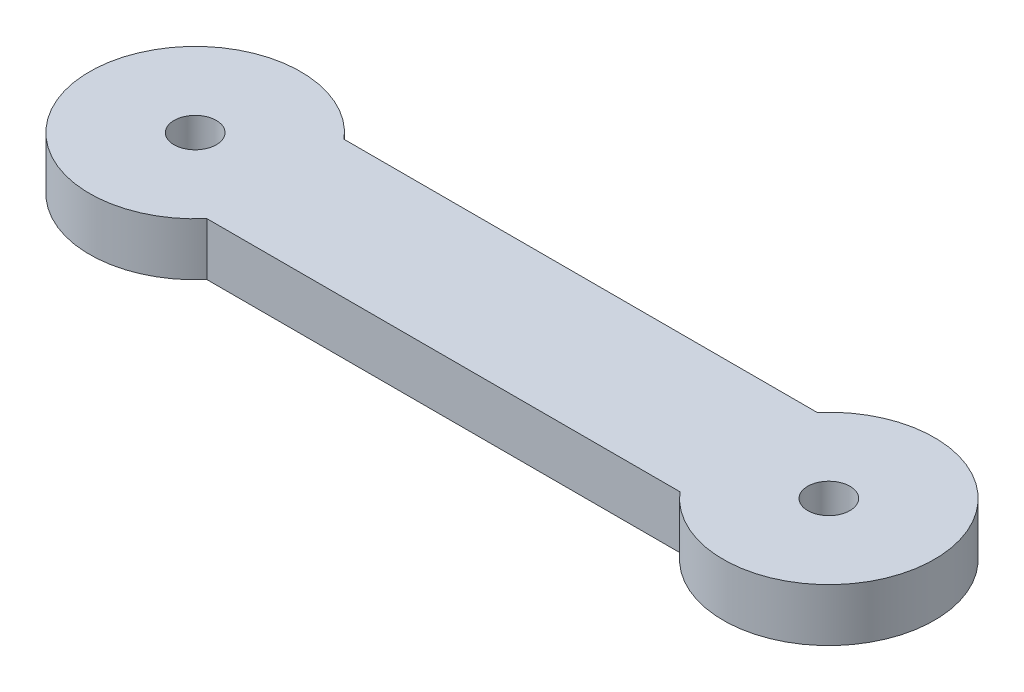
ISO-10303-21;
HEADER;
FILE_DESCRIPTION(('STEP AP214'),'2;1');
FILE_NAME('part.step','',(''),(''),'','','');
FILE_SCHEMA(('AUTOMOTIVE_DESIGN { 1 0 10303 214 1 1 1 1 }'));
ENDSEC;
DATA;
#1=APPLICATION_CONTEXT('core data for automotive mechanical design processes');
#2=APPLICATION_PROTOCOL_DEFINITION('international standard','automotive_design',2000,#1);
#3=PRODUCT_CONTEXT('',#1,'mechanical');
#4=PRODUCT('Part','Part','',(#3));
#5=PRODUCT_RELATED_PRODUCT_CATEGORY('part','',(#4));
#6=PRODUCT_DEFINITION_FORMATION('','',#4);
#7=PRODUCT_DEFINITION_CONTEXT('part definition',#1,'design');
#8=PRODUCT_DEFINITION('design','',#6,#7);
#9=PRODUCT_DEFINITION_SHAPE('','',#8);
#10=(LENGTH_UNIT() NAMED_UNIT(*) SI_UNIT(.MILLI.,.METRE.));
#11=(NAMED_UNIT(*) PLANE_ANGLE_UNIT() SI_UNIT($,.RADIAN.));
#12=(NAMED_UNIT(*) SI_UNIT($,.STERADIAN.) SOLID_ANGLE_UNIT());
#13=UNCERTAINTY_MEASURE_WITH_UNIT(LENGTH_MEASURE(1.E-05),#10,'distance_accuracy_value','');
#14=(GEOMETRIC_REPRESENTATION_CONTEXT(3) GLOBAL_UNCERTAINTY_ASSIGNED_CONTEXT((#13)) GLOBAL_UNIT_ASSIGNED_CONTEXT((#10,
#11,#12)) REPRESENTATION_CONTEXT('',''));
#15=CARTESIAN_POINT('',(0.,0.,0.));
#16=DIRECTION('',(0.,0.,1.));
#17=DIRECTION('',(1.,0.,0.));
#18=AXIS2_PLACEMENT_3D('',#15,#16,#17);
#19=CARTESIAN_POINT('',(30.,5.,0.));
#20=DIRECTION('',(0.,-1.,0.));
#21=DIRECTION('',(0.,0.,-1.));
#22=AXIS2_PLACEMENT_3D('',#19,#20,#21);
#23=CYLINDRICAL_SURFACE('',#22,10.);
#24=CARTESIAN_POINT('',(30.,0.,0.));
#25=DIRECTION('',(0.,1.,0.));
#26=DIRECTION('',(0.,0.,1.));
#27=AXIS2_PLACEMENT_3D('',#24,#25,#26);
#28=CIRCLE('',#27,10.);
#29=CARTESIAN_POINT('',(22.4006579232147,0.,6.5));
#30=VERTEX_POINT('',#29);
#31=CARTESIAN_POINT('',(22.4006579232147,0.,-6.5));
#32=VERTEX_POINT('',#31);
#33=EDGE_CURVE('E92',#30,#32,#28,.T.);
#34=ORIENTED_EDGE('',*,*,#33,.T.);
#35=DIRECTION('',(0.,-1.,0.));
#36=VECTOR('',#35,1.);
#37=CARTESIAN_POINT('',(22.4006579232147,5.,-6.5));
#38=LINE('',#37,#36);
#39=CARTESIAN_POINT('',(22.4006579232147,5.,-6.5));
#40=VERTEX_POINT('',#39);
#41=EDGE_CURVE('E11',#40,#32,#38,.T.);
#42=ORIENTED_EDGE('',*,*,#41,.F.);
#43=CARTESIAN_POINT('',(30.,5.,0.));
#44=DIRECTION('',(0.,1.,0.));
#45=DIRECTION('',(0.,0.,1.));
#46=AXIS2_PLACEMENT_3D('',#43,#44,#45);
#47=CIRCLE('',#46,10.);
#48=CARTESIAN_POINT('',(22.4006579232147,5.,6.5));
#49=VERTEX_POINT('',#48);
#50=EDGE_CURVE('E118',#49,#40,#47,.T.);
#51=ORIENTED_EDGE('',*,*,#50,.F.);
#52=DIRECTION('',(0.,-1.,0.));
#53=VECTOR('',#52,1.);
#54=CARTESIAN_POINT('',(22.4006579232147,5.,6.5));
#55=LINE('',#54,#53);
#56=EDGE_CURVE('E50',#49,#30,#55,.T.);
#57=ORIENTED_EDGE('',*,*,#56,.T.);
#58=EDGE_LOOP('',(#34,#42,#51,#57));
#59=FACE_BOUND('',#58,.T.);
#60=ADVANCED_FACE('F41',(#59),#23,.T.);
#61=CARTESIAN_POINT('',(0.,5.,-6.5));
#62=DIRECTION('',(0.,0.,-1.));
#63=DIRECTION('',(-1.,0.,0.));
#64=AXIS2_PLACEMENT_3D('',#61,#62,#63);
#65=PLANE('',#64);
#66=DIRECTION('',(1.,0.,0.));
#67=VECTOR('',#66,1.);
#68=CARTESIAN_POINT('',(0.,0.,-6.5));
#69=LINE('',#68,#67);
#70=CARTESIAN_POINT('',(-22.4006579232147,0.,-6.5));
#71=VERTEX_POINT('',#70);
#72=EDGE_CURVE('E82',#71,#32,#69,.T.);
#73=ORIENTED_EDGE('',*,*,#72,.F.);
#74=DIRECTION('',(0.,-1.,0.));
#75=VECTOR('',#74,1.);
#76=CARTESIAN_POINT('',(-22.4006579232147,5.,-6.5));
#77=LINE('',#76,#75);
#78=CARTESIAN_POINT('',(-22.4006579232147,5.,-6.5));
#79=VERTEX_POINT('',#78);
#80=EDGE_CURVE('E85',#79,#71,#77,.T.);
#81=ORIENTED_EDGE('',*,*,#80,.F.);
#82=DIRECTION('',(1.,0.,0.));
#83=VECTOR('',#82,1.);
#84=CARTESIAN_POINT('',(0.,5.,-6.5));
#85=LINE('',#84,#83);
#86=EDGE_CURVE('E74',#79,#40,#85,.T.);
#87=ORIENTED_EDGE('',*,*,#86,.T.);
#88=ORIENTED_EDGE('',*,*,#41,.T.);
#89=EDGE_LOOP('',(#73,#81,#87,#88));
#90=FACE_BOUND('',#89,.T.);
#91=ADVANCED_FACE('F84',(#90),#65,.T.);
#92=CARTESIAN_POINT('',(0.,5.,6.5));
#93=DIRECTION('',(0.,0.,1.));
#94=DIRECTION('',(1.,0.,0.));
#95=AXIS2_PLACEMENT_3D('',#92,#93,#94);
#96=PLANE('',#95);
#97=DIRECTION('',(-1.,0.,0.));
#98=VECTOR('',#97,1.);
#99=CARTESIAN_POINT('',(0.,0.,6.5));
#100=LINE('',#99,#98);
#101=CARTESIAN_POINT('',(-22.4006579232147,0.,6.5));
#102=VERTEX_POINT('',#101);
#103=EDGE_CURVE('E91',#30,#102,#100,.T.);
#104=ORIENTED_EDGE('',*,*,#103,.F.);
#105=ORIENTED_EDGE('',*,*,#56,.F.);
#106=DIRECTION('',(-1.,0.,0.));
#107=VECTOR('',#106,1.);
#108=CARTESIAN_POINT('',(0.,5.,6.5));
#109=LINE('',#108,#107);
#110=CARTESIAN_POINT('',(-22.4006579232147,5.,6.5));
#111=VERTEX_POINT('',#110);
#112=EDGE_CURVE('E124',#49,#111,#109,.T.);
#113=ORIENTED_EDGE('',*,*,#112,.T.);
#114=DIRECTION('',(0.,-1.,0.));
#115=VECTOR('',#114,1.);
#116=CARTESIAN_POINT('',(-22.4006579232147,5.,6.5));
#117=LINE('',#116,#115);
#118=EDGE_CURVE('E101',#111,#102,#117,.T.);
#119=ORIENTED_EDGE('',*,*,#118,.T.);
#120=EDGE_LOOP('',(#104,#105,#113,#119));
#121=FACE_BOUND('',#120,.T.);
#122=ADVANCED_FACE('F140',(#121),#96,.T.);
#123=CARTESIAN_POINT('',(30.,5.,0.));
#124=DIRECTION('',(0.,-1.,0.));
#125=DIRECTION('',(0.,0.,-1.));
#126=AXIS2_PLACEMENT_3D('',#123,#124,#125);
#127=CYLINDRICAL_SURFACE('',#126,2.);
#128=CARTESIAN_POINT('',(30.,5.,0.));
#129=DIRECTION('',(0.,1.,0.));
#130=DIRECTION('',(0.,0.,1.));
#131=AXIS2_PLACEMENT_3D('',#128,#129,#130);
#132=CIRCLE('',#131,2.);
#133=CARTESIAN_POINT('',(30.,5.,2.));
#134=VERTEX_POINT('',#133);
#135=EDGE_CURVE('E127',#134,#134,#132,.T.);
#136=ORIENTED_EDGE('',*,*,#135,.T.);
#137=EDGE_LOOP('',(#136));
#138=FACE_BOUND('',#137,.T.);
#139=CARTESIAN_POINT('',(30.,0.,0.));
#140=DIRECTION('',(0.,1.,0.));
#141=DIRECTION('',(0.,0.,1.));
#142=AXIS2_PLACEMENT_3D('',#139,#140,#141);
#143=CIRCLE('',#142,2.);
#144=CARTESIAN_POINT('',(30.,0.,2.));
#145=VERTEX_POINT('',#144);
#146=EDGE_CURVE('E121',#145,#145,#143,.T.);
#147=ORIENTED_EDGE('',*,*,#146,.F.);
#148=EDGE_LOOP('',(#147));
#149=FACE_BOUND('',#148,.T.);
#150=ADVANCED_FACE('F162',(#138,#149),#127,.F.);
#151=CARTESIAN_POINT('',(0.,5.,0.));
#152=DIRECTION('',(0.,1.,0.));
#153=DIRECTION('',(0.,0.,1.));
#154=AXIS2_PLACEMENT_3D('',#151,#152,#153);
#155=PLANE('',#154);
#156=ORIENTED_EDGE('',*,*,#50,.T.);
#157=ORIENTED_EDGE('',*,*,#86,.F.);
#158=CARTESIAN_POINT('',(-30.,5.,0.));
#159=DIRECTION('',(0.,-1.,0.));
#160=DIRECTION('',(0.,0.,1.));
#161=AXIS2_PLACEMENT_3D('',#158,#159,#160);
#162=CIRCLE('',#161,10.);
#163=EDGE_CURVE('E99',#111,#79,#162,.T.);
#164=ORIENTED_EDGE('',*,*,#163,.F.);
#165=ORIENTED_EDGE('',*,*,#112,.F.);
#166=EDGE_LOOP('',(#156,#157,#164,#165));
#167=FACE_BOUND('',#166,.T.);
#168=ORIENTED_EDGE('',*,*,#135,.F.);
#169=EDGE_LOOP('',(#168));
#170=FACE_BOUND('',#169,.T.);
#171=CARTESIAN_POINT('',(-30.,5.,0.));
#172=DIRECTION('',(0.,-1.,0.));
#173=DIRECTION('',(0.,0.,1.));
#174=AXIS2_PLACEMENT_3D('',#171,#172,#173);
#175=CIRCLE('',#174,2.);
#176=CARTESIAN_POINT('',(-30.,5.,2.));
#177=VERTEX_POINT('',#176);
#178=EDGE_CURVE('E102',#177,#177,#175,.T.);
#179=ORIENTED_EDGE('',*,*,#178,.T.);
#180=EDGE_LOOP('',(#179));
#181=FACE_BOUND('',#180,.T.);
#182=ADVANCED_FACE('F141',(#167,#170,#181),#155,.T.);
#183=CARTESIAN_POINT('',(0.,0.,0.));
#184=DIRECTION('',(0.,1.,0.));
#185=DIRECTION('',(0.,0.,1.));
#186=AXIS2_PLACEMENT_3D('',#183,#184,#185);
#187=PLANE('',#186);
#188=ORIENTED_EDGE('',*,*,#33,.F.);
#189=ORIENTED_EDGE('',*,*,#103,.T.);
#190=CARTESIAN_POINT('',(-30.,0.,0.));
#191=DIRECTION('',(0.,-1.,0.));
#192=DIRECTION('',(0.,0.,1.));
#193=AXIS2_PLACEMENT_3D('',#190,#191,#192);
#194=CIRCLE('',#193,10.);
#195=EDGE_CURVE('E98',#102,#71,#194,.T.);
#196=ORIENTED_EDGE('',*,*,#195,.T.);
#197=ORIENTED_EDGE('',*,*,#72,.T.);
#198=EDGE_LOOP('',(#188,#189,#196,#197));
#199=FACE_BOUND('',#198,.T.);
#200=ORIENTED_EDGE('',*,*,#146,.T.);
#201=EDGE_LOOP('',(#200));
#202=FACE_BOUND('',#201,.T.);
#203=CARTESIAN_POINT('',(-30.,0.,0.));
#204=DIRECTION('',(0.,-1.,0.));
#205=DIRECTION('',(0.,0.,1.));
#206=AXIS2_PLACEMENT_3D('',#203,#204,#205);
#207=CIRCLE('',#206,2.);
#208=CARTESIAN_POINT('',(-30.,0.,2.));
#209=VERTEX_POINT('',#208);
#210=EDGE_CURVE('E108',#209,#209,#207,.T.);
#211=ORIENTED_EDGE('',*,*,#210,.F.);
#212=EDGE_LOOP('',(#211));
#213=FACE_BOUND('',#212,.T.);
#214=ADVANCED_FACE('F104',(#199,#202,#213),#187,.F.);
#215=CARTESIAN_POINT('',(-30.,5.,0.));
#216=DIRECTION('',(0.,-1.,0.));
#217=DIRECTION('',(0.,0.,-1.));
#218=AXIS2_PLACEMENT_3D('',#215,#216,#217);
#219=CYLINDRICAL_SURFACE('',#218,10.);
#220=ORIENTED_EDGE('',*,*,#195,.F.);
#221=ORIENTED_EDGE('',*,*,#118,.F.);
#222=ORIENTED_EDGE('',*,*,#163,.T.);
#223=ORIENTED_EDGE('',*,*,#80,.T.);
#224=EDGE_LOOP('',(#220,#221,#222,#223));
#225=FACE_BOUND('',#224,.T.);
#226=ADVANCED_FACE('F96',(#225),#219,.T.);
#227=CARTESIAN_POINT('',(-30.,5.,0.));
#228=DIRECTION('',(0.,-1.,0.));
#229=DIRECTION('',(0.,0.,-1.));
#230=AXIS2_PLACEMENT_3D('',#227,#228,#229);
#231=CYLINDRICAL_SURFACE('',#230,2.);
#232=ORIENTED_EDGE('',*,*,#178,.F.);
#233=EDGE_LOOP('',(#232));
#234=FACE_BOUND('',#233,.T.);
#235=ORIENTED_EDGE('',*,*,#210,.T.);
#236=EDGE_LOOP('',(#235));
#237=FACE_BOUND('',#236,.T.);
#238=ADVANCED_FACE('F149',(#234,#237),#231,.F.);
#239=CLOSED_SHELL('',(#60,#91,#122,#150,#182,#214,#226,#238));
#240=MANIFOLD_SOLID_BREP('B2',#239);
#241=ADVANCED_BREP_SHAPE_REPRESENTATION('',(#18,#240),#14);
#242=SHAPE_DEFINITION_REPRESENTATION(#9,#241);
ENDSEC;
END-ISO-10303-21;
